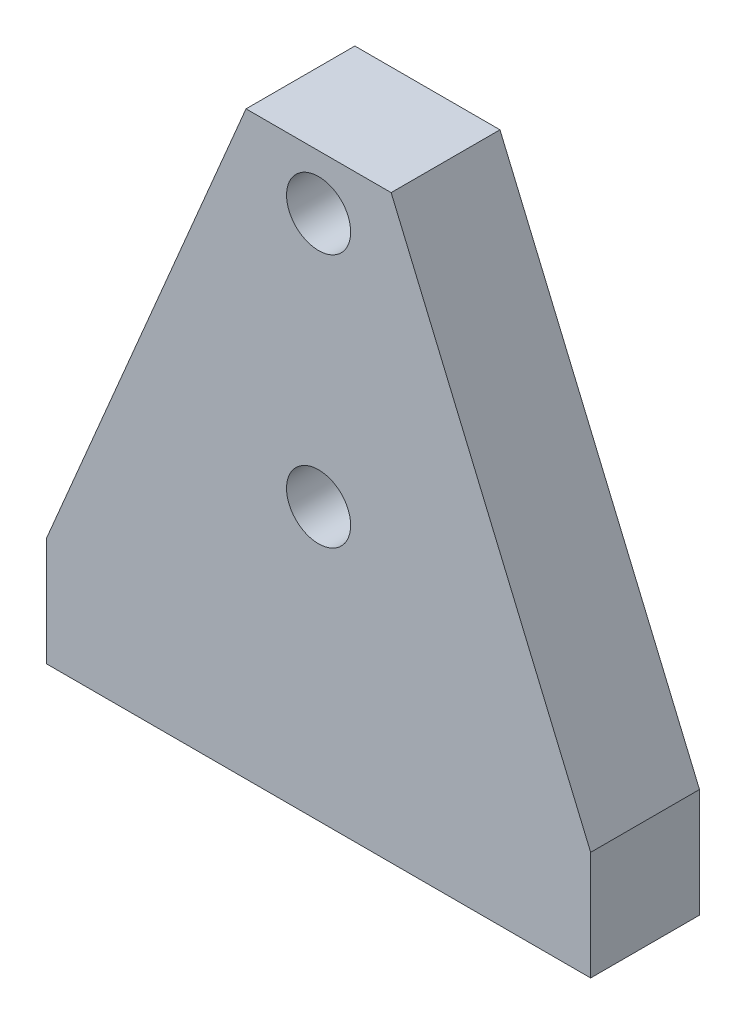
ISO-10303-21;
HEADER;
FILE_DESCRIPTION(('STEP AP214'),'2;1');
FILE_NAME('part.step','',(''),(''),'','','');
FILE_SCHEMA(('AUTOMOTIVE_DESIGN { 1 0 10303 214 1 1 1 1 }'));
ENDSEC;
DATA;
#1=APPLICATION_CONTEXT('core data for automotive mechanical design processes');
#2=APPLICATION_PROTOCOL_DEFINITION('international standard','automotive_design',2000,#1);
#3=PRODUCT_CONTEXT('',#1,'mechanical');
#4=PRODUCT('Part','Part','',(#3));
#5=PRODUCT_RELATED_PRODUCT_CATEGORY('part','',(#4));
#6=PRODUCT_DEFINITION_FORMATION('','',#4);
#7=PRODUCT_DEFINITION_CONTEXT('part definition',#1,'design');
#8=PRODUCT_DEFINITION('design','',#6,#7);
#9=PRODUCT_DEFINITION_SHAPE('','',#8);
#10=(LENGTH_UNIT() NAMED_UNIT(*) SI_UNIT(.MILLI.,.METRE.));
#11=(NAMED_UNIT(*) PLANE_ANGLE_UNIT() SI_UNIT($,.RADIAN.));
#12=(NAMED_UNIT(*) SI_UNIT($,.STERADIAN.) SOLID_ANGLE_UNIT());
#13=UNCERTAINTY_MEASURE_WITH_UNIT(LENGTH_MEASURE(1.E-05),#10,'distance_accuracy_value','');
#14=(GEOMETRIC_REPRESENTATION_CONTEXT(3) GLOBAL_UNCERTAINTY_ASSIGNED_CONTEXT((#13)) GLOBAL_UNIT_ASSIGNED_CONTEXT((#10,
#11,#12)) REPRESENTATION_CONTEXT('',''));
#15=CARTESIAN_POINT('',(0.,0.,0.));
#16=DIRECTION('',(0.,0.,1.));
#17=DIRECTION('',(1.,0.,0.));
#18=AXIS2_PLACEMENT_3D('',#15,#16,#17);
#19=CARTESIAN_POINT('',(-14.5006273525722,6.13488080301129,9.525));
#20=DIRECTION('',(-0.920967251068559,0.389639990836697,0.));
#21=DIRECTION('',(-0.389639990836697,-0.920967251068559,0.));
#22=AXIS2_PLACEMENT_3D('',#19,#20,#21);
#23=PLANE('',#22);
#24=DIRECTION('',(0.389639990836697,0.920967251068559,0.));
#25=VECTOR('',#24,1.);
#26=CARTESIAN_POINT('',(-14.5006273525722,6.13488080301129,0.));
#27=LINE('',#26,#25);
#28=CARTESIAN_POINT('',(-23.8125,-15.875,0.));
#29=VERTEX_POINT('',#28);
#30=CARTESIAN_POINT('',(-6.35000000000003,25.4,0.));
#31=VERTEX_POINT('',#30);
#32=EDGE_CURVE('E119',#29,#31,#27,.T.);
#33=ORIENTED_EDGE('',*,*,#32,.F.);
#34=DIRECTION('',(0.,0.,-1.));
#35=VECTOR('',#34,1.);
#36=CARTESIAN_POINT('',(-23.8125,-15.875,9.525));
#37=LINE('',#36,#35);
#38=CARTESIAN_POINT('',(-23.8125,-15.875,9.525));
#39=VERTEX_POINT('',#38);
#40=EDGE_CURVE('E11',#39,#29,#37,.T.);
#41=ORIENTED_EDGE('',*,*,#40,.F.);
#42=DIRECTION('',(0.389639990836697,0.920967251068559,0.));
#43=VECTOR('',#42,1.);
#44=CARTESIAN_POINT('',(-14.5006273525722,6.13488080301129,9.525));
#45=LINE('',#44,#43);
#46=CARTESIAN_POINT('',(-6.35000000000003,25.4,9.525));
#47=VERTEX_POINT('',#46);
#48=EDGE_CURVE('E133',#39,#47,#45,.T.);
#49=ORIENTED_EDGE('',*,*,#48,.T.);
#50=DIRECTION('',(0.,0.,-1.));
#51=VECTOR('',#50,1.);
#52=CARTESIAN_POINT('',(-6.35000000000003,25.4,9.525));
#53=LINE('',#52,#51);
#54=EDGE_CURVE('E52',#47,#31,#53,.T.);
#55=ORIENTED_EDGE('',*,*,#54,.T.);
#56=EDGE_LOOP('',(#33,#41,#49,#55));
#57=FACE_BOUND('',#56,.T.);
#58=ADVANCED_FACE('F36',(#57),#23,.T.);
#59=CARTESIAN_POINT('',(-23.8125,0.,9.525));
#60=DIRECTION('',(1.,0.,0.));
#61=DIRECTION('',(0.,1.,0.));
#62=AXIS2_PLACEMENT_3D('',#59,#60,#61);
#63=PLANE('',#62);
#64=DIRECTION('',(0.,-1.,0.));
#65=VECTOR('',#64,1.);
#66=CARTESIAN_POINT('',(-23.8125,0.,0.));
#67=LINE('',#66,#65);
#68=CARTESIAN_POINT('',(-23.8125,-25.4,0.));
#69=VERTEX_POINT('',#68);
#70=EDGE_CURVE('E121',#29,#69,#67,.T.);
#71=ORIENTED_EDGE('',*,*,#70,.T.);
#72=DIRECTION('',(0.,0.,-1.));
#73=VECTOR('',#72,1.);
#74=CARTESIAN_POINT('',(-23.8125,-25.4,9.525));
#75=LINE('',#74,#73);
#76=CARTESIAN_POINT('',(-23.8125,-25.4,9.525));
#77=VERTEX_POINT('',#76);
#78=EDGE_CURVE('E44',#77,#69,#75,.T.);
#79=ORIENTED_EDGE('',*,*,#78,.F.);
#80=DIRECTION('',(0.,-1.,0.));
#81=VECTOR('',#80,1.);
#82=CARTESIAN_POINT('',(-23.8125,0.,9.525));
#83=LINE('',#82,#81);
#84=EDGE_CURVE('E114',#39,#77,#83,.T.);
#85=ORIENTED_EDGE('',*,*,#84,.F.);
#86=ORIENTED_EDGE('',*,*,#40,.T.);
#87=EDGE_LOOP('',(#71,#79,#85,#86));
#88=FACE_BOUND('',#87,.T.);
#89=ADVANCED_FACE('F157',(#88),#63,.F.);
#90=CARTESIAN_POINT('',(0.,-25.4,9.525));
#91=DIRECTION('',(0.,1.,0.));
#92=DIRECTION('',(0.,0.,1.));
#93=AXIS2_PLACEMENT_3D('',#90,#91,#92);
#94=PLANE('',#93);
#95=CARTESIAN_POINT('',(-13.9954,-25.4,4.76250000000001));
#96=DIRECTION('',(0.,-1.,0.));
#97=DIRECTION('',(0.,0.,-1.));
#98=AXIS2_PLACEMENT_3D('',#95,#96,#97);
#99=CIRCLE('',#98,2.49999999999999);
#100=CARTESIAN_POINT('',(-13.9954,-25.4,2.26250000000002));
#101=VERTEX_POINT('',#100);
#102=EDGE_CURVE('E277',#101,#101,#99,.T.);
#103=ORIENTED_EDGE('',*,*,#102,.F.);
#104=EDGE_LOOP('',(#103));
#105=FACE_BOUND('',#104,.T.);
#106=CARTESIAN_POINT('',(13.9954,-25.4,4.76250000000001));
#107=DIRECTION('',(0.,-1.,0.));
#108=DIRECTION('',(0.,0.,-1.));
#109=AXIS2_PLACEMENT_3D('',#106,#107,#108);
#110=CIRCLE('',#109,2.49999999999999);
#111=CARTESIAN_POINT('',(13.9954,-25.4,2.26250000000001));
#112=VERTEX_POINT('',#111);
#113=EDGE_CURVE('E279',#112,#112,#110,.T.);
#114=ORIENTED_EDGE('',*,*,#113,.F.);
#115=EDGE_LOOP('',(#114));
#116=FACE_BOUND('',#115,.T.);
#117=DIRECTION('',(1.,0.,0.));
#118=VECTOR('',#117,1.);
#119=CARTESIAN_POINT('',(0.,-25.4,0.));
#120=LINE('',#119,#118);
#121=CARTESIAN_POINT('',(23.8125,-25.4,0.));
#122=VERTEX_POINT('',#121);
#123=EDGE_CURVE('E124',#69,#122,#120,.T.);
#124=ORIENTED_EDGE('',*,*,#123,.T.);
#125=DIRECTION('',(0.,0.,-1.));
#126=VECTOR('',#125,1.);
#127=CARTESIAN_POINT('',(23.8125,-25.4,9.525));
#128=LINE('',#127,#126);
#129=CARTESIAN_POINT('',(23.8125,-25.4,9.525));
#130=VERTEX_POINT('',#129);
#131=EDGE_CURVE('E100',#130,#122,#128,.T.);
#132=ORIENTED_EDGE('',*,*,#131,.F.);
#133=DIRECTION('',(1.,0.,0.));
#134=VECTOR('',#133,1.);
#135=CARTESIAN_POINT('',(0.,-25.4,9.525));
#136=LINE('',#135,#134);
#137=EDGE_CURVE('E111',#77,#130,#136,.T.);
#138=ORIENTED_EDGE('',*,*,#137,.F.);
#139=ORIENTED_EDGE('',*,*,#78,.T.);
#140=EDGE_LOOP('',(#124,#132,#138,#139));
#141=FACE_BOUND('',#140,.T.);
#142=ADVANCED_FACE('F140',(#105,#116,#141),#94,.F.);
#143=CARTESIAN_POINT('',(23.8125,0.,9.525));
#144=DIRECTION('',(1.,0.,0.));
#145=DIRECTION('',(0.,1.,0.));
#146=AXIS2_PLACEMENT_3D('',#143,#144,#145);
#147=PLANE('',#146);
#148=DIRECTION('',(0.,-1.,0.));
#149=VECTOR('',#148,1.);
#150=CARTESIAN_POINT('',(23.8125,0.,0.));
#151=LINE('',#150,#149);
#152=CARTESIAN_POINT('',(23.8125,-15.875,0.));
#153=VERTEX_POINT('',#152);
#154=EDGE_CURVE('E97',#153,#122,#151,.T.);
#155=ORIENTED_EDGE('',*,*,#154,.F.);
#156=DIRECTION('',(0.,0.,-1.));
#157=VECTOR('',#156,1.);
#158=CARTESIAN_POINT('',(23.8125,-15.875,9.525));
#159=LINE('',#158,#157);
#160=CARTESIAN_POINT('',(23.8125,-15.875,9.525));
#161=VERTEX_POINT('',#160);
#162=EDGE_CURVE('E91',#161,#153,#159,.T.);
#163=ORIENTED_EDGE('',*,*,#162,.F.);
#164=DIRECTION('',(0.,-1.,0.));
#165=VECTOR('',#164,1.);
#166=CARTESIAN_POINT('',(23.8125,0.,9.525));
#167=LINE('',#166,#165);
#168=EDGE_CURVE('E95',#161,#130,#167,.T.);
#169=ORIENTED_EDGE('',*,*,#168,.T.);
#170=ORIENTED_EDGE('',*,*,#131,.T.);
#171=EDGE_LOOP('',(#155,#163,#169,#170));
#172=FACE_BOUND('',#171,.T.);
#173=ADVANCED_FACE('F93',(#172),#147,.T.);
#174=CARTESIAN_POINT('',(14.5006273525722,6.1348808030113,9.525));
#175=DIRECTION('',(-0.920967251068559,-0.389639990836697,0.));
#176=DIRECTION('',(0.389639990836697,-0.920967251068559,0.));
#177=AXIS2_PLACEMENT_3D('',#174,#175,#176);
#178=PLANE('',#177);
#179=DIRECTION('',(-0.389639990836697,0.920967251068559,0.));
#180=VECTOR('',#179,1.);
#181=CARTESIAN_POINT('',(14.5006273525722,6.1348808030113,0.));
#182=LINE('',#181,#180);
#183=CARTESIAN_POINT('',(6.35000000000005,25.4,0.));
#184=VERTEX_POINT('',#183);
#185=EDGE_CURVE('E128',#153,#184,#182,.T.);
#186=ORIENTED_EDGE('',*,*,#185,.T.);
#187=DIRECTION('',(0.,0.,-1.));
#188=VECTOR('',#187,1.);
#189=CARTESIAN_POINT('',(6.35000000000005,25.4,9.525));
#190=LINE('',#189,#188);
#191=CARTESIAN_POINT('',(6.35000000000005,25.4,9.525));
#192=VERTEX_POINT('',#191);
#193=EDGE_CURVE('E72',#192,#184,#190,.T.);
#194=ORIENTED_EDGE('',*,*,#193,.F.);
#195=DIRECTION('',(-0.389639990836697,0.920967251068559,0.));
#196=VECTOR('',#195,1.);
#197=CARTESIAN_POINT('',(14.5006273525722,6.1348808030113,9.525));
#198=LINE('',#197,#196);
#199=EDGE_CURVE('E102',#161,#192,#198,.T.);
#200=ORIENTED_EDGE('',*,*,#199,.F.);
#201=ORIENTED_EDGE('',*,*,#162,.T.);
#202=EDGE_LOOP('',(#186,#194,#200,#201));
#203=FACE_BOUND('',#202,.T.);
#204=ADVANCED_FACE('F103',(#203),#178,.F.);
#205=CARTESIAN_POINT('',(0.,25.4,9.525));
#206=DIRECTION('',(0.,1.,0.));
#207=DIRECTION('',(0.,0.,1.));
#208=AXIS2_PLACEMENT_3D('',#205,#206,#207);
#209=PLANE('',#208);
#210=DIRECTION('',(1.,0.,0.));
#211=VECTOR('',#210,1.);
#212=CARTESIAN_POINT('',(0.,25.4,0.));
#213=LINE('',#212,#211);
#214=EDGE_CURVE('E130',#31,#184,#213,.T.);
#215=ORIENTED_EDGE('',*,*,#214,.F.);
#216=ORIENTED_EDGE('',*,*,#54,.F.);
#217=DIRECTION('',(1.,0.,0.));
#218=VECTOR('',#217,1.);
#219=CARTESIAN_POINT('',(0.,25.4,9.525));
#220=LINE('',#219,#218);
#221=EDGE_CURVE('E106',#47,#192,#220,.T.);
#222=ORIENTED_EDGE('',*,*,#221,.T.);
#223=ORIENTED_EDGE('',*,*,#193,.T.);
#224=EDGE_LOOP('',(#215,#216,#222,#223));
#225=FACE_BOUND('',#224,.T.);
#226=ADVANCED_FACE('F145',(#225),#209,.T.);
#227=CARTESIAN_POINT('',(0.,0.,9.525));
#228=DIRECTION('',(0.,0.,1.));
#229=DIRECTION('',(1.,0.,0.));
#230=AXIS2_PLACEMENT_3D('',#227,#228,#229);
#231=PLANE('',#230);
#232=CARTESIAN_POINT('',(0.,20.6375,9.525));
#233=DIRECTION('',(0.,0.,1.));
#234=DIRECTION('',(1.,0.,0.));
#235=AXIS2_PLACEMENT_3D('',#232,#233,#234);
#236=CIRCLE('',#235,2.80669999999999);
#237=CARTESIAN_POINT('',(2.80669999999998,20.6375,9.525));
#238=VERTEX_POINT('',#237);
#239=EDGE_CURVE('E287',#238,#238,#236,.T.);
#240=ORIENTED_EDGE('',*,*,#239,.F.);
#241=EDGE_LOOP('',(#240));
#242=FACE_BOUND('',#241,.T.);
#243=CARTESIAN_POINT('',(0.,-1.58749999999999,9.525));
#244=DIRECTION('',(0.,0.,1.));
#245=DIRECTION('',(1.,0.,0.));
#246=AXIS2_PLACEMENT_3D('',#243,#244,#245);
#247=CIRCLE('',#246,2.80669999999999);
#248=CARTESIAN_POINT('',(2.80669999999998,-1.58749999999999,9.525));
#249=VERTEX_POINT('',#248);
#250=EDGE_CURVE('E293',#249,#249,#247,.T.);
#251=ORIENTED_EDGE('',*,*,#250,.F.);
#252=EDGE_LOOP('',(#251));
#253=FACE_BOUND('',#252,.T.);
#254=ORIENTED_EDGE('',*,*,#48,.F.);
#255=ORIENTED_EDGE('',*,*,#84,.T.);
#256=ORIENTED_EDGE('',*,*,#137,.T.);
#257=ORIENTED_EDGE('',*,*,#168,.F.);
#258=ORIENTED_EDGE('',*,*,#199,.T.);
#259=ORIENTED_EDGE('',*,*,#221,.F.);
#260=EDGE_LOOP('',(#254,#255,#256,#257,#258,#259));
#261=FACE_BOUND('',#260,.T.);
#262=ADVANCED_FACE('F109',(#242,#253,#261),#231,.T.);
#263=CARTESIAN_POINT('',(0.,0.,0.));
#264=DIRECTION('',(0.,0.,1.));
#265=DIRECTION('',(1.,0.,0.));
#266=AXIS2_PLACEMENT_3D('',#263,#264,#265);
#267=PLANE('',#266);
#268=CARTESIAN_POINT('',(0.,20.6375,0.));
#269=DIRECTION('',(0.,0.,1.));
#270=DIRECTION('',(1.,0.,0.));
#271=AXIS2_PLACEMENT_3D('',#268,#269,#270);
#272=CIRCLE('',#271,2.8067);
#273=CARTESIAN_POINT('',(2.80669999999999,20.6375,0.));
#274=VERTEX_POINT('',#273);
#275=EDGE_CURVE('E290',#274,#274,#272,.T.);
#276=ORIENTED_EDGE('',*,*,#275,.T.);
#277=EDGE_LOOP('',(#276));
#278=FACE_BOUND('',#277,.T.);
#279=CARTESIAN_POINT('',(0.,-1.58749999999999,0.));
#280=DIRECTION('',(0.,0.,1.));
#281=DIRECTION('',(1.,0.,0.));
#282=AXIS2_PLACEMENT_3D('',#279,#280,#281);
#283=CIRCLE('',#282,2.8067);
#284=CARTESIAN_POINT('',(2.80669999999999,-1.58749999999999,0.));
#285=VERTEX_POINT('',#284);
#286=EDGE_CURVE('E122',#285,#285,#283,.T.);
#287=ORIENTED_EDGE('',*,*,#286,.T.);
#288=EDGE_LOOP('',(#287));
#289=FACE_BOUND('',#288,.T.);
#290=ORIENTED_EDGE('',*,*,#32,.T.);
#291=ORIENTED_EDGE('',*,*,#214,.T.);
#292=ORIENTED_EDGE('',*,*,#185,.F.);
#293=ORIENTED_EDGE('',*,*,#154,.T.);
#294=ORIENTED_EDGE('',*,*,#123,.F.);
#295=ORIENTED_EDGE('',*,*,#70,.F.);
#296=EDGE_LOOP('',(#290,#291,#292,#293,#294,#295));
#297=FACE_BOUND('',#296,.T.);
#298=ADVANCED_FACE('F144',(#278,#289,#297),#267,.F.);
#299=CARTESIAN_POINT('',(0.,-1.58749999999999,9.525));
#300=DIRECTION('',(0.,0.,1.));
#301=DIRECTION('',(1.,0.,0.));
#302=AXIS2_PLACEMENT_3D('',#299,#300,#301);
#303=CYLINDRICAL_SURFACE('',#302,2.80669999999999);
#304=ORIENTED_EDGE('',*,*,#286,.F.);
#305=EDGE_LOOP('',(#304));
#306=FACE_BOUND('',#305,.T.);
#307=ORIENTED_EDGE('',*,*,#250,.T.);
#308=EDGE_LOOP('',(#307));
#309=FACE_BOUND('',#308,.T.);
#310=ADVANCED_FACE('F195',(#306,#309),#303,.F.);
#311=CARTESIAN_POINT('',(0.,20.6375,9.525));
#312=DIRECTION('',(0.,0.,1.));
#313=DIRECTION('',(1.,0.,0.));
#314=AXIS2_PLACEMENT_3D('',#311,#312,#313);
#315=CYLINDRICAL_SURFACE('',#314,2.80669999999999);
#316=ORIENTED_EDGE('',*,*,#275,.F.);
#317=EDGE_LOOP('',(#316));
#318=FACE_BOUND('',#317,.T.);
#319=ORIENTED_EDGE('',*,*,#239,.T.);
#320=EDGE_LOOP('',(#319));
#321=FACE_BOUND('',#320,.T.);
#322=ADVANCED_FACE('F204',(#318,#321),#315,.F.);
#323=CARTESIAN_POINT('',(13.9954,-12.3952,4.76250000000001));
#324=DIRECTION('',(0.,1.,0.));
#325=DIRECTION('',(0.,0.,1.));
#326=AXIS2_PLACEMENT_3D('',#323,#324,#325);
#327=PLANE('',#326);
#328=CARTESIAN_POINT('',(13.9954,-12.3952,4.76250000000001));
#329=DIRECTION('',(0.,-1.,0.));
#330=DIRECTION('',(0.,0.,-1.));
#331=AXIS2_PLACEMENT_3D('',#328,#329,#330);
#332=CIRCLE('',#331,2.49999999999999);
#333=CARTESIAN_POINT('',(13.9954,-12.3952,2.26250000000002));
#334=VERTEX_POINT('',#333);
#335=EDGE_CURVE('E284',#334,#334,#332,.T.);
#336=ORIENTED_EDGE('',*,*,#335,.T.);
#337=EDGE_LOOP('',(#336));
#338=FACE_BOUND('',#337,.T.);
#339=ADVANCED_FACE('F213',(#338),#327,.F.);
#340=CARTESIAN_POINT('',(13.9954,-25.4,4.76250000000001));
#341=DIRECTION('',(0.,-1.,0.));
#342=DIRECTION('',(0.,0.,-1.));
#343=AXIS2_PLACEMENT_3D('',#340,#341,#342);
#344=CYLINDRICAL_SURFACE('',#343,2.49999999999999);
#345=ORIENTED_EDGE('',*,*,#335,.F.);
#346=EDGE_LOOP('',(#345));
#347=FACE_BOUND('',#346,.T.);
#348=ORIENTED_EDGE('',*,*,#113,.T.);
#349=EDGE_LOOP('',(#348));
#350=FACE_BOUND('',#349,.T.);
#351=ADVANCED_FACE('F229',(#347,#350),#344,.F.);
#352=CARTESIAN_POINT('',(-13.9954,-12.3952,4.76250000000001));
#353=DIRECTION('',(0.,1.,0.));
#354=DIRECTION('',(0.,0.,1.));
#355=AXIS2_PLACEMENT_3D('',#352,#353,#354);
#356=PLANE('',#355);
#357=CARTESIAN_POINT('',(-13.9954,-12.3952,4.76250000000001));
#358=DIRECTION('',(0.,-1.,0.));
#359=DIRECTION('',(0.,0.,-1.));
#360=AXIS2_PLACEMENT_3D('',#357,#358,#359);
#361=CIRCLE('',#360,2.49999999999999);
#362=CARTESIAN_POINT('',(-13.9954,-12.3952,2.26250000000002));
#363=VERTEX_POINT('',#362);
#364=EDGE_CURVE('E274',#363,#363,#361,.T.);
#365=ORIENTED_EDGE('',*,*,#364,.T.);
#366=EDGE_LOOP('',(#365));
#367=FACE_BOUND('',#366,.T.);
#368=ADVANCED_FACE('F240',(#367),#356,.F.);
#369=CARTESIAN_POINT('',(-13.9954,-25.4,4.76250000000001));
#370=DIRECTION('',(0.,-1.,0.));
#371=DIRECTION('',(0.,0.,-1.));
#372=AXIS2_PLACEMENT_3D('',#369,#370,#371);
#373=CYLINDRICAL_SURFACE('',#372,2.49999999999999);
#374=ORIENTED_EDGE('',*,*,#364,.F.);
#375=EDGE_LOOP('',(#374));
#376=FACE_BOUND('',#375,.T.);
#377=ORIENTED_EDGE('',*,*,#102,.T.);
#378=EDGE_LOOP('',(#377));
#379=FACE_BOUND('',#378,.T.);
#380=ADVANCED_FACE('F252',(#376,#379),#373,.F.);
#381=CLOSED_SHELL('',(#58,#89,#142,#173,#204,#226,#262,#298,#310,#322,#339,#351,#368,#380));
#382=MANIFOLD_SOLID_BREP('B2',#381);
#383=ADVANCED_BREP_SHAPE_REPRESENTATION('',(#18,#382),#14);
#384=SHAPE_DEFINITION_REPRESENTATION(#9,#383);
ENDSEC;
END-ISO-10303-21;
